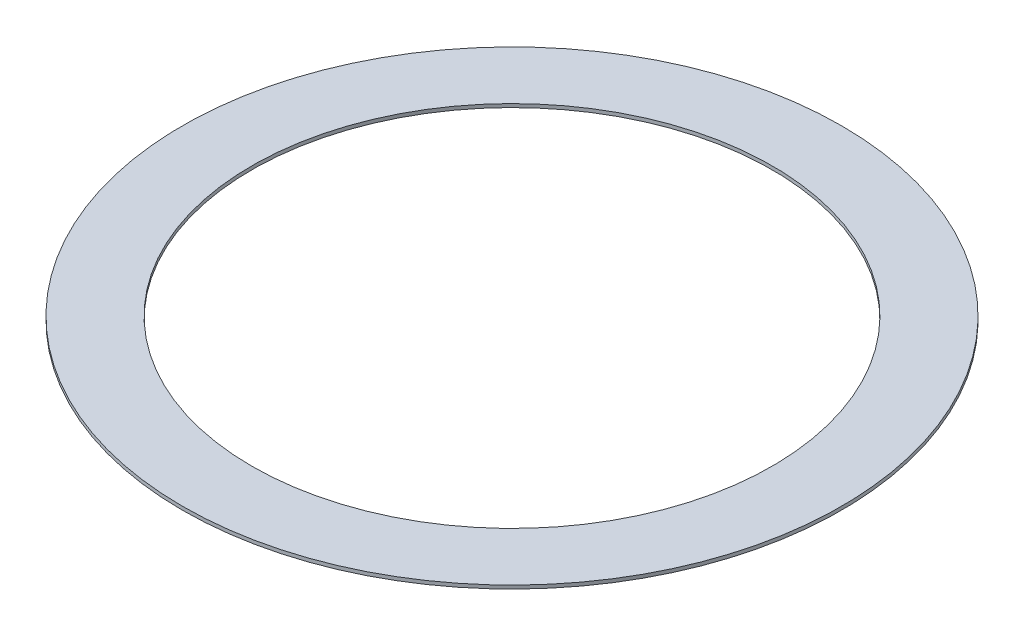
ISO-10303-21;
HEADER;
FILE_DESCRIPTION(('STEP AP214'),'2;1');
FILE_NAME('part.step','',(''),(''),'','','');
FILE_SCHEMA(('AUTOMOTIVE_DESIGN { 1 0 10303 214 1 1 1 1 }'));
ENDSEC;
DATA;
#1=APPLICATION_CONTEXT('core data for automotive mechanical design processes');
#2=APPLICATION_PROTOCOL_DEFINITION('international standard','automotive_design',2000,#1);
#3=PRODUCT_CONTEXT('',#1,'mechanical');
#4=PRODUCT('Part','Part','',(#3));
#5=PRODUCT_RELATED_PRODUCT_CATEGORY('part','',(#4));
#6=PRODUCT_DEFINITION_FORMATION('','',#4);
#7=PRODUCT_DEFINITION_CONTEXT('part definition',#1,'design');
#8=PRODUCT_DEFINITION('design','',#6,#7);
#9=PRODUCT_DEFINITION_SHAPE('','',#8);
#10=(LENGTH_UNIT() NAMED_UNIT(*) SI_UNIT(.MILLI.,.METRE.));
#11=(NAMED_UNIT(*) PLANE_ANGLE_UNIT() SI_UNIT($,.RADIAN.));
#12=(NAMED_UNIT(*) SI_UNIT($,.STERADIAN.) SOLID_ANGLE_UNIT());
#13=UNCERTAINTY_MEASURE_WITH_UNIT(LENGTH_MEASURE(1.E-05),#10,'distance_accuracy_value','');
#14=(GEOMETRIC_REPRESENTATION_CONTEXT(3) GLOBAL_UNCERTAINTY_ASSIGNED_CONTEXT((#13)) GLOBAL_UNIT_ASSIGNED_CONTEXT((#10,
#11,#12)) REPRESENTATION_CONTEXT('',''));
#15=CARTESIAN_POINT('',(0.,0.,0.));
#16=DIRECTION('',(0.,0.,1.));
#17=DIRECTION('',(1.,0.,0.));
#18=AXIS2_PLACEMENT_3D('',#15,#16,#17);
#19=CARTESIAN_POINT('',(0.,1.,0.));
#20=DIRECTION('',(0.,1.,0.));
#21=DIRECTION('',(0.,0.,1.));
#22=AXIS2_PLACEMENT_3D('',#19,#20,#21);
#23=PLANE('',#22);
#24=CARTESIAN_POINT('',(0.,1.,0.));
#25=DIRECTION('',(0.,1.,0.));
#26=DIRECTION('',(0.,0.,1.));
#27=AXIS2_PLACEMENT_3D('',#24,#25,#26);
#28=CIRCLE('',#27,95.);
#29=CARTESIAN_POINT('',(0.,1.,95.));
#30=VERTEX_POINT('',#29);
#31=EDGE_CURVE('E10',#30,#30,#28,.T.);
#32=ORIENTED_EDGE('',*,*,#31,.T.);
#33=EDGE_LOOP('',(#32));
#34=FACE_BOUND('',#33,.T.);
#35=CARTESIAN_POINT('',(0.,1.,0.));
#36=DIRECTION('',(0.,1.,0.));
#37=DIRECTION('',(0.,0.,1.));
#38=AXIS2_PLACEMENT_3D('',#35,#36,#37);
#39=CIRCLE('',#38,75.);
#40=CARTESIAN_POINT('',(0.,1.,75.));
#41=VERTEX_POINT('',#40);
#42=EDGE_CURVE('E42',#41,#41,#39,.T.);
#43=ORIENTED_EDGE('',*,*,#42,.F.);
#44=EDGE_LOOP('',(#43));
#45=FACE_BOUND('',#44,.T.);
#46=ADVANCED_FACE('F31',(#34,#45),#23,.T.);
#47=CARTESIAN_POINT('',(0.,0.,0.));
#48=DIRECTION('',(0.,1.,0.));
#49=DIRECTION('',(0.,0.,1.));
#50=AXIS2_PLACEMENT_3D('',#47,#48,#49);
#51=PLANE('',#50);
#52=CARTESIAN_POINT('',(0.,0.,0.));
#53=DIRECTION('',(0.,1.,0.));
#54=DIRECTION('',(0.,0.,1.));
#55=AXIS2_PLACEMENT_3D('',#52,#53,#54);
#56=CIRCLE('',#55,95.);
#57=CARTESIAN_POINT('',(0.,0.,95.));
#58=VERTEX_POINT('',#57);
#59=EDGE_CURVE('E35',#58,#58,#56,.T.);
#60=ORIENTED_EDGE('',*,*,#59,.F.);
#61=EDGE_LOOP('',(#60));
#62=FACE_BOUND('',#61,.T.);
#63=CARTESIAN_POINT('',(0.,0.,0.));
#64=DIRECTION('',(0.,1.,0.));
#65=DIRECTION('',(0.,0.,1.));
#66=AXIS2_PLACEMENT_3D('',#63,#64,#65);
#67=CIRCLE('',#66,75.);
#68=CARTESIAN_POINT('',(0.,0.,75.));
#69=VERTEX_POINT('',#68);
#70=EDGE_CURVE('E44',#69,#69,#67,.T.);
#71=ORIENTED_EDGE('',*,*,#70,.T.);
#72=EDGE_LOOP('',(#71));
#73=FACE_BOUND('',#72,.T.);
#74=ADVANCED_FACE('F54',(#62,#73),#51,.F.);
#75=CARTESIAN_POINT('',(0.,1.,0.));
#76=DIRECTION('',(0.,-1.,0.));
#77=DIRECTION('',(0.,0.,-1.));
#78=AXIS2_PLACEMENT_3D('',#75,#76,#77);
#79=CYLINDRICAL_SURFACE('',#78,95.);
#80=ORIENTED_EDGE('',*,*,#31,.F.);
#81=EDGE_LOOP('',(#80));
#82=FACE_BOUND('',#81,.T.);
#83=ORIENTED_EDGE('',*,*,#59,.T.);
#84=EDGE_LOOP('',(#83));
#85=FACE_BOUND('',#84,.T.);
#86=ADVANCED_FACE('F33',(#82,#85),#79,.T.);
#87=CARTESIAN_POINT('',(0.,1.,0.));
#88=DIRECTION('',(0.,-1.,0.));
#89=DIRECTION('',(0.,0.,-1.));
#90=AXIS2_PLACEMENT_3D('',#87,#88,#89);
#91=CYLINDRICAL_SURFACE('',#90,75.);
#92=ORIENTED_EDGE('',*,*,#42,.T.);
#93=EDGE_LOOP('',(#92));
#94=FACE_BOUND('',#93,.T.);
#95=ORIENTED_EDGE('',*,*,#70,.F.);
#96=EDGE_LOOP('',(#95));
#97=FACE_BOUND('',#96,.T.);
#98=ADVANCED_FACE('F50',(#94,#97),#91,.F.);
#99=CLOSED_SHELL('',(#46,#74,#86,#98));
#100=MANIFOLD_SOLID_BREP('B2',#99);
#101=ADVANCED_BREP_SHAPE_REPRESENTATION('',(#18,#100),#14);
#102=SHAPE_DEFINITION_REPRESENTATION(#9,#101);
ENDSEC;
END-ISO-10303-21;
